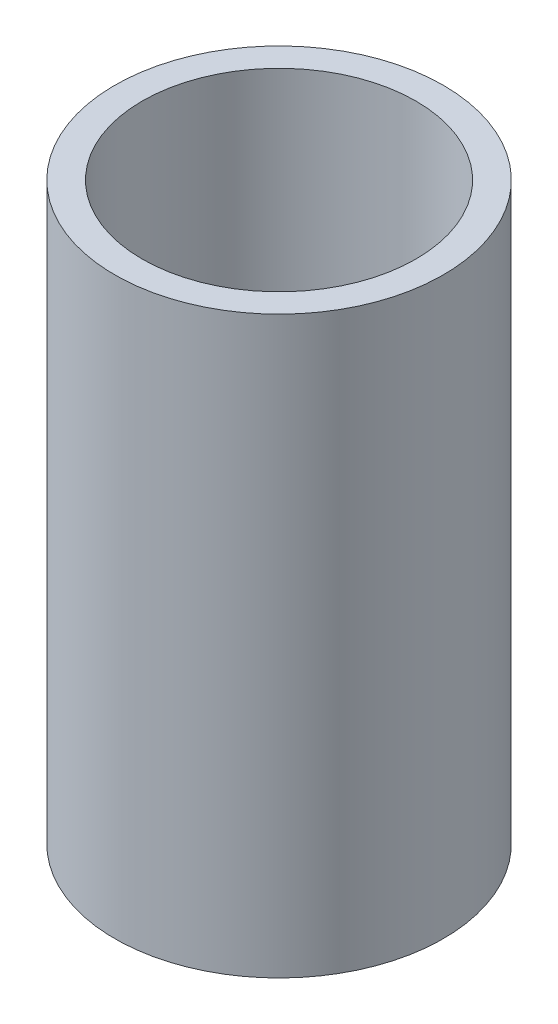
ISO-10303-21;
HEADER;
FILE_DESCRIPTION(('STEP AP214'),'2;1');
FILE_NAME('part.step','',(''),(''),'','','');
FILE_SCHEMA(('AUTOMOTIVE_DESIGN { 1 0 10303 214 1 1 1 1 }'));
ENDSEC;
DATA;
#1=APPLICATION_CONTEXT('core data for automotive mechanical design processes');
#2=APPLICATION_PROTOCOL_DEFINITION('international standard','automotive_design',2000,#1);
#3=PRODUCT_CONTEXT('',#1,'mechanical');
#4=PRODUCT('Part','Part','',(#3));
#5=PRODUCT_RELATED_PRODUCT_CATEGORY('part','',(#4));
#6=PRODUCT_DEFINITION_FORMATION('','',#4);
#7=PRODUCT_DEFINITION_CONTEXT('part definition',#1,'design');
#8=PRODUCT_DEFINITION('design','',#6,#7);
#9=PRODUCT_DEFINITION_SHAPE('','',#8);
#10=(LENGTH_UNIT() NAMED_UNIT(*) SI_UNIT(.MILLI.,.METRE.));
#11=(NAMED_UNIT(*) PLANE_ANGLE_UNIT() SI_UNIT($,.RADIAN.));
#12=(NAMED_UNIT(*) SI_UNIT($,.STERADIAN.) SOLID_ANGLE_UNIT());
#13=UNCERTAINTY_MEASURE_WITH_UNIT(LENGTH_MEASURE(1.E-05),#10,'distance_accuracy_value','');
#14=(GEOMETRIC_REPRESENTATION_CONTEXT(3) GLOBAL_UNCERTAINTY_ASSIGNED_CONTEXT((#13)) GLOBAL_UNIT_ASSIGNED_CONTEXT((#10,
#11,#12)) REPRESENTATION_CONTEXT('',''));
#15=CARTESIAN_POINT('',(0.,0.,0.));
#16=DIRECTION('',(0.,0.,1.));
#17=DIRECTION('',(1.,0.,0.));
#18=AXIS2_PLACEMENT_3D('',#15,#16,#17);
#19=CARTESIAN_POINT('',(0.,21.,0.));
#20=DIRECTION('',(0.,1.,0.));
#21=DIRECTION('',(0.,0.,1.));
#22=AXIS2_PLACEMENT_3D('',#19,#20,#21);
#23=PLANE('',#22);
#24=CARTESIAN_POINT('',(0.,21.,0.));
#25=DIRECTION('',(0.,1.,0.));
#26=DIRECTION('',(0.,0.,1.));
#27=AXIS2_PLACEMENT_3D('',#24,#25,#26);
#28=CIRCLE('',#27,6.);
#29=CARTESIAN_POINT('',(0.,21.,-6.));
#30=VERTEX_POINT('',#29);
#31=EDGE_CURVE('E10',#30,#30,#28,.T.);
#32=ORIENTED_EDGE('',*,*,#31,.T.);
#33=EDGE_LOOP('',(#32));
#34=FACE_BOUND('',#33,.T.);
#35=CARTESIAN_POINT('',(0.,21.,0.));
#36=DIRECTION('',(0.,1.,0.));
#37=DIRECTION('',(0.,0.,1.));
#38=AXIS2_PLACEMENT_3D('',#35,#36,#37);
#39=CIRCLE('',#38,5.);
#40=CARTESIAN_POINT('',(0.,21.,-5.));
#41=VERTEX_POINT('',#40);
#42=EDGE_CURVE('E43',#41,#41,#39,.T.);
#43=ORIENTED_EDGE('',*,*,#42,.F.);
#44=EDGE_LOOP('',(#43));
#45=FACE_BOUND('',#44,.T.);
#46=ADVANCED_FACE('F32',(#34,#45),#23,.T.);
#47=CARTESIAN_POINT('',(0.,0.,0.));
#48=DIRECTION('',(0.,1.,0.));
#49=DIRECTION('',(0.,0.,1.));
#50=AXIS2_PLACEMENT_3D('',#47,#48,#49);
#51=PLANE('',#50);
#52=CARTESIAN_POINT('',(0.,0.,0.));
#53=DIRECTION('',(0.,1.,0.));
#54=DIRECTION('',(0.,0.,1.));
#55=AXIS2_PLACEMENT_3D('',#52,#53,#54);
#56=CIRCLE('',#55,6.);
#57=CARTESIAN_POINT('',(0.,0.,-6.));
#58=VERTEX_POINT('',#57);
#59=EDGE_CURVE('E36',#58,#58,#56,.T.);
#60=ORIENTED_EDGE('',*,*,#59,.F.);
#61=EDGE_LOOP('',(#60));
#62=FACE_BOUND('',#61,.T.);
#63=CARTESIAN_POINT('',(0.,0.,0.));
#64=DIRECTION('',(0.,1.,0.));
#65=DIRECTION('',(0.,0.,1.));
#66=AXIS2_PLACEMENT_3D('',#63,#64,#65);
#67=CIRCLE('',#66,5.);
#68=CARTESIAN_POINT('',(0.,0.,-5.));
#69=VERTEX_POINT('',#68);
#70=EDGE_CURVE('E45',#69,#69,#67,.T.);
#71=ORIENTED_EDGE('',*,*,#70,.T.);
#72=EDGE_LOOP('',(#71));
#73=FACE_BOUND('',#72,.T.);
#74=ADVANCED_FACE('F55',(#62,#73),#51,.F.);
#75=CARTESIAN_POINT('',(0.,21.,0.));
#76=DIRECTION('',(0.,-1.,0.));
#77=DIRECTION('',(0.,0.,-1.));
#78=AXIS2_PLACEMENT_3D('',#75,#76,#77);
#79=CYLINDRICAL_SURFACE('',#78,6.);
#80=CARTESIAN_POINT('',(0.,21.,-6.));
#81=CARTESIAN_POINT('',(0.,20.78125,-6.));
#82=CARTESIAN_POINT('',(0.,20.5625,-6.));
#83=CARTESIAN_POINT('',(0.,20.125,-6.));
#84=CARTESIAN_POINT('',(0.,19.90625,-6.));
#85=CARTESIAN_POINT('',(0.,19.46875,-6.));
#86=CARTESIAN_POINT('',(0.,19.25,-6.));
#87=CARTESIAN_POINT('',(0.,18.8125,-6.));
#88=CARTESIAN_POINT('',(0.,18.59375,-6.));
#89=CARTESIAN_POINT('',(0.,18.15625,-6.));
#90=CARTESIAN_POINT('',(0.,17.9375,-6.));
#91=CARTESIAN_POINT('',(0.,17.5,-6.));
#92=CARTESIAN_POINT('',(0.,17.28125,-6.));
#93=CARTESIAN_POINT('',(0.,16.84375,-6.));
#94=CARTESIAN_POINT('',(0.,16.625,-6.));
#95=CARTESIAN_POINT('',(0.,16.1875,-6.));
#96=CARTESIAN_POINT('',(0.,15.96875,-6.));
#97=CARTESIAN_POINT('',(0.,15.53125,-6.));
#98=CARTESIAN_POINT('',(0.,15.3125,-6.));
#99=CARTESIAN_POINT('',(0.,14.875,-6.));
#100=CARTESIAN_POINT('',(0.,14.65625,-6.));
#101=CARTESIAN_POINT('',(0.,14.21875,-6.));
#102=CARTESIAN_POINT('',(0.,14.,-6.));
#103=CARTESIAN_POINT('',(0.,13.5625,-6.));
#104=CARTESIAN_POINT('',(0.,13.34375,-6.));
#105=CARTESIAN_POINT('',(0.,12.90625,-6.));
#106=CARTESIAN_POINT('',(0.,12.6875,-6.));
#107=CARTESIAN_POINT('',(0.,12.25,-6.));
#108=CARTESIAN_POINT('',(0.,12.03125,-6.));
#109=CARTESIAN_POINT('',(0.,11.59375,-6.));
#110=CARTESIAN_POINT('',(0.,11.375,-6.));
#111=CARTESIAN_POINT('',(0.,10.9375,-6.));
#112=CARTESIAN_POINT('',(0.,10.71875,-6.));
#113=CARTESIAN_POINT('',(0.,10.28125,-6.));
#114=CARTESIAN_POINT('',(0.,10.0625,-6.));
#115=CARTESIAN_POINT('',(0.,9.625,-6.));
#116=CARTESIAN_POINT('',(0.,9.40625,-6.));
#117=CARTESIAN_POINT('',(0.,8.96875,-6.));
#118=CARTESIAN_POINT('',(0.,8.75,-6.));
#119=CARTESIAN_POINT('',(0.,8.3125,-6.));
#120=CARTESIAN_POINT('',(0.,8.09375,-6.));
#121=CARTESIAN_POINT('',(0.,7.65625,-6.));
#122=CARTESIAN_POINT('',(0.,7.4375,-6.));
#123=CARTESIAN_POINT('',(0.,7.,-6.));
#124=CARTESIAN_POINT('',(0.,6.78125,-6.));
#125=CARTESIAN_POINT('',(0.,6.34375,-6.));
#126=CARTESIAN_POINT('',(0.,6.125,-6.));
#127=CARTESIAN_POINT('',(0.,5.6875,-6.));
#128=CARTESIAN_POINT('',(0.,5.46875,-6.));
#129=CARTESIAN_POINT('',(0.,5.03125,-6.));
#130=CARTESIAN_POINT('',(0.,4.8125,-6.));
#131=CARTESIAN_POINT('',(0.,4.375,-6.));
#132=CARTESIAN_POINT('',(0.,4.15625,-6.));
#133=CARTESIAN_POINT('',(0.,3.71875,-6.));
#134=CARTESIAN_POINT('',(0.,3.5,-6.));
#135=CARTESIAN_POINT('',(0.,3.0625,-6.));
#136=CARTESIAN_POINT('',(0.,2.84375,-6.));
#137=CARTESIAN_POINT('',(0.,2.40625,-6.));
#138=CARTESIAN_POINT('',(0.,2.1875,-6.));
#139=CARTESIAN_POINT('',(0.,1.75,-6.));
#140=CARTESIAN_POINT('',(0.,1.53125,-6.));
#141=CARTESIAN_POINT('',(0.,1.09375,-6.));
#142=CARTESIAN_POINT('',(0.,0.875000000000001,-6.));
#143=CARTESIAN_POINT('',(0.,0.4375,-6.));
#144=CARTESIAN_POINT('',(0.,0.21875,-6.));
#145=CARTESIAN_POINT('',(0.,0.,-6.));
#146=B_SPLINE_CURVE_WITH_KNOTS('',3,(#80,#81,#82,#83,#84,#85,#86,#87,#88,#89,#90,#91,#92,#93,
#94,#95,#96,#97,#98,#99,#100,#101,#102,#103,#104,#105,#106,#107,#108,#109,#110,#111,#112,#113,
#114,#115,#116,#117,#118,#119,#120,#121,#122,#123,#124,#125,#126,#127,#128,#129,#130,#131,#132,
#133,#134,#135,#136,#137,#138,#139,#140,#141,#142,#143,#144,#145),.UNSPECIFIED.,.F.,.F.,(4,2,2,
2,2,2,2,2,2,2,2,2,2,2,2,2,2,2,2,2,2,2,2,2,2,2,2,2,2,2,2,2,4),(0.,0.656249999999997,1.3125,
1.96875,2.625,3.28125,3.9375,4.59375,5.25,5.90625,6.5625,7.21875,7.875,8.53125,9.1875,9.84375,
10.5,11.15625,11.8125,12.46875,13.125,13.78125,14.4375,15.09375,15.75,16.40625,17.0625,17.71875,
18.375,19.03125,19.6875,20.34375,21.),.UNSPECIFIED.);
#147=EDGE_CURVE('BSEAM34',#30,#58,#146,.T.);
#148=ORIENTED_EDGE('',*,*,#31,.F.);
#149=ORIENTED_EDGE('',*,*,#59,.T.);
#150=ORIENTED_EDGE('',*,*,#147,.T.);
#151=ORIENTED_EDGE('',*,*,#147,.F.);
#152=EDGE_LOOP('',(#148,#150,#149,#151));
#153=FACE_BOUND('',#152,.T.);
#154=ADVANCED_FACE('F34',(#153),#79,.T.);
#155=CARTESIAN_POINT('',(0.,21.,0.));
#156=DIRECTION('',(0.,-1.,0.));
#157=DIRECTION('',(0.,0.,-1.));
#158=AXIS2_PLACEMENT_3D('',#155,#156,#157);
#159=CYLINDRICAL_SURFACE('',#158,5.);
#160=CARTESIAN_POINT('',(0.,21.,-5.));
#161=CARTESIAN_POINT('',(0.,20.78125,-5.));
#162=CARTESIAN_POINT('',(0.,20.5625,-5.));
#163=CARTESIAN_POINT('',(0.,20.125,-5.));
#164=CARTESIAN_POINT('',(0.,19.90625,-5.));
#165=CARTESIAN_POINT('',(0.,19.46875,-5.));
#166=CARTESIAN_POINT('',(0.,19.25,-5.));
#167=CARTESIAN_POINT('',(0.,18.8125,-5.));
#168=CARTESIAN_POINT('',(0.,18.59375,-5.));
#169=CARTESIAN_POINT('',(0.,18.15625,-5.));
#170=CARTESIAN_POINT('',(0.,17.9375,-5.));
#171=CARTESIAN_POINT('',(0.,17.5,-5.));
#172=CARTESIAN_POINT('',(0.,17.28125,-5.));
#173=CARTESIAN_POINT('',(0.,16.84375,-5.));
#174=CARTESIAN_POINT('',(0.,16.625,-5.));
#175=CARTESIAN_POINT('',(0.,16.1875,-5.));
#176=CARTESIAN_POINT('',(0.,15.96875,-5.));
#177=CARTESIAN_POINT('',(0.,15.53125,-5.));
#178=CARTESIAN_POINT('',(0.,15.3125,-5.));
#179=CARTESIAN_POINT('',(0.,14.875,-5.));
#180=CARTESIAN_POINT('',(0.,14.65625,-5.));
#181=CARTESIAN_POINT('',(0.,14.21875,-5.));
#182=CARTESIAN_POINT('',(0.,14.,-5.));
#183=CARTESIAN_POINT('',(0.,13.5625,-5.));
#184=CARTESIAN_POINT('',(0.,13.34375,-5.));
#185=CARTESIAN_POINT('',(0.,12.90625,-5.));
#186=CARTESIAN_POINT('',(0.,12.6875,-5.));
#187=CARTESIAN_POINT('',(0.,12.25,-5.));
#188=CARTESIAN_POINT('',(0.,12.03125,-5.));
#189=CARTESIAN_POINT('',(0.,11.59375,-5.));
#190=CARTESIAN_POINT('',(0.,11.375,-5.));
#191=CARTESIAN_POINT('',(0.,10.9375,-5.));
#192=CARTESIAN_POINT('',(0.,10.71875,-5.));
#193=CARTESIAN_POINT('',(0.,10.28125,-5.));
#194=CARTESIAN_POINT('',(0.,10.0625,-5.));
#195=CARTESIAN_POINT('',(0.,9.625,-5.));
#196=CARTESIAN_POINT('',(0.,9.40625,-5.));
#197=CARTESIAN_POINT('',(0.,8.96875,-5.));
#198=CARTESIAN_POINT('',(0.,8.75,-5.));
#199=CARTESIAN_POINT('',(0.,8.3125,-5.));
#200=CARTESIAN_POINT('',(0.,8.09375,-5.));
#201=CARTESIAN_POINT('',(0.,7.65625,-5.));
#202=CARTESIAN_POINT('',(0.,7.4375,-5.));
#203=CARTESIAN_POINT('',(0.,7.,-5.));
#204=CARTESIAN_POINT('',(0.,6.78125,-5.));
#205=CARTESIAN_POINT('',(0.,6.34375,-5.));
#206=CARTESIAN_POINT('',(0.,6.125,-5.));
#207=CARTESIAN_POINT('',(0.,5.6875,-5.));
#208=CARTESIAN_POINT('',(0.,5.46875,-5.));
#209=CARTESIAN_POINT('',(0.,5.03125,-5.));
#210=CARTESIAN_POINT('',(0.,4.8125,-5.));
#211=CARTESIAN_POINT('',(0.,4.375,-5.));
#212=CARTESIAN_POINT('',(0.,4.15625,-5.));
#213=CARTESIAN_POINT('',(0.,3.71875,-5.));
#214=CARTESIAN_POINT('',(0.,3.5,-5.));
#215=CARTESIAN_POINT('',(0.,3.0625,-5.));
#216=CARTESIAN_POINT('',(0.,2.84375,-5.));
#217=CARTESIAN_POINT('',(0.,2.40625,-5.));
#218=CARTESIAN_POINT('',(0.,2.1875,-5.));
#219=CARTESIAN_POINT('',(0.,1.75,-5.));
#220=CARTESIAN_POINT('',(0.,1.53125,-5.));
#221=CARTESIAN_POINT('',(0.,1.09375,-5.));
#222=CARTESIAN_POINT('',(0.,0.875000000000001,-5.));
#223=CARTESIAN_POINT('',(0.,0.4375,-5.));
#224=CARTESIAN_POINT('',(0.,0.21875,-5.));
#225=CARTESIAN_POINT('',(0.,0.,-5.));
#226=B_SPLINE_CURVE_WITH_KNOTS('',3,(#160,#161,#162,#163,#164,#165,#166,#167,#168,#169,#170,
#171,#172,#173,#174,#175,#176,#177,#178,#179,#180,#181,#182,#183,#184,#185,#186,#187,#188,#189,
#190,#191,#192,#193,#194,#195,#196,#197,#198,#199,#200,#201,#202,#203,#204,#205,#206,#207,#208,
#209,#210,#211,#212,#213,#214,#215,#216,#217,#218,#219,#220,#221,#222,#223,#224,#225),
.UNSPECIFIED.,.F.,.F.,(4,2,2,2,2,2,2,2,2,2,2,2,2,2,2,2,2,2,2,2,2,2,2,2,2,2,2,2,2,2,2,2,4),(0.,
0.656250000000001,1.3125,1.96875,2.625,3.28125,3.9375,4.59375,5.25,5.90625,6.5625,7.21875,7.875,
8.53125,9.1875,9.84375,10.5,11.15625,11.8125,12.46875,13.125,13.78125,14.4375,15.09375,15.75,
16.40625,17.0625,17.71875,18.375,19.03125,19.6875,20.34375,21.),.UNSPECIFIED.);
#227=EDGE_CURVE('BSEAM51',#41,#69,#226,.T.);
#228=ORIENTED_EDGE('',*,*,#42,.T.);
#229=ORIENTED_EDGE('',*,*,#70,.F.);
#230=ORIENTED_EDGE('',*,*,#227,.T.);
#231=ORIENTED_EDGE('',*,*,#227,.F.);
#232=EDGE_LOOP('',(#228,#230,#229,#231));
#233=FACE_BOUND('',#232,.T.);
#234=ADVANCED_FACE('F51',(#233),#159,.F.);
#235=CLOSED_SHELL('',(#46,#74,#154,#234));
#236=MANIFOLD_SOLID_BREP('B2',#235);
#237=ADVANCED_BREP_SHAPE_REPRESENTATION('',(#18,#236),#14);
#238=SHAPE_DEFINITION_REPRESENTATION(#9,#237);
ENDSEC;
END-ISO-10303-21;
